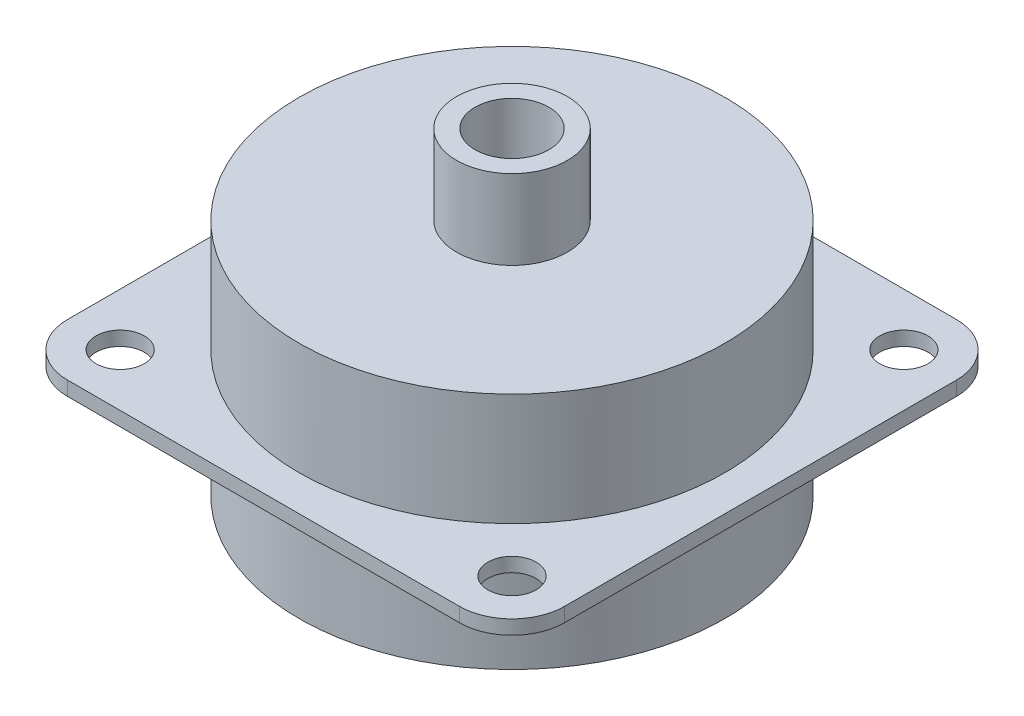
ISO-10303-21;
HEADER;
FILE_DESCRIPTION(('STEP AP214'),'2;1');
FILE_NAME('part.step','',(''),(''),'','','');
FILE_SCHEMA(('AUTOMOTIVE_DESIGN { 1 0 10303 214 1 1 1 1 }'));
ENDSEC;
DATA;
#1=APPLICATION_CONTEXT('core data for automotive mechanical design processes');
#2=APPLICATION_PROTOCOL_DEFINITION('international standard','automotive_design',2000,#1);
#3=PRODUCT_CONTEXT('',#1,'mechanical');
#4=PRODUCT('Part','Part','',(#3));
#5=PRODUCT_RELATED_PRODUCT_CATEGORY('part','',(#4));
#6=PRODUCT_DEFINITION_FORMATION('','',#4);
#7=PRODUCT_DEFINITION_CONTEXT('part definition',#1,'design');
#8=PRODUCT_DEFINITION('design','',#6,#7);
#9=PRODUCT_DEFINITION_SHAPE('','',#8);
#10=(LENGTH_UNIT() NAMED_UNIT(*) SI_UNIT(.MILLI.,.METRE.));
#11=(NAMED_UNIT(*) PLANE_ANGLE_UNIT() SI_UNIT($,.RADIAN.));
#12=(NAMED_UNIT(*) SI_UNIT($,.STERADIAN.) SOLID_ANGLE_UNIT());
#13=UNCERTAINTY_MEASURE_WITH_UNIT(LENGTH_MEASURE(1.E-05),#10,'distance_accuracy_value','');
#14=(GEOMETRIC_REPRESENTATION_CONTEXT(3) GLOBAL_UNCERTAINTY_ASSIGNED_CONTEXT((#13)) GLOBAL_UNIT_ASSIGNED_CONTEXT((#10,
#11,#12)) REPRESENTATION_CONTEXT('',''));
#15=CARTESIAN_POINT('',(0.,0.,0.));
#16=DIRECTION('',(0.,0.,1.));
#17=DIRECTION('',(1.,0.,0.));
#18=AXIS2_PLACEMENT_3D('',#15,#16,#17);
#19=CARTESIAN_POINT('',(0.,35.814,0.));
#20=DIRECTION('',(0.,1.,0.));
#21=DIRECTION('',(-1.,0.,0.));
#22=AXIS2_PLACEMENT_3D('',#19,#20,#21);
#23=CYLINDRICAL_SURFACE('',#22,19.05);
#24=CARTESIAN_POINT('',(0.,7.366,0.));
#25=DIRECTION('',(0.,1.,0.));
#26=DIRECTION('',(-1.,0.,0.));
#27=AXIS2_PLACEMENT_3D('',#24,#25,#26);
#28=CIRCLE('',#27,19.05);
#29=CARTESIAN_POINT('',(-19.05,7.366,0.));
#30=VERTEX_POINT('',#29);
#31=EDGE_CURVE('E166',#30,#30,#28,.T.);
#32=ORIENTED_EDGE('',*,*,#31,.T.);
#33=EDGE_LOOP('',(#32));
#34=FACE_BOUND('',#33,.T.);
#35=CARTESIAN_POINT('',(0.,17.399,0.));
#36=DIRECTION('',(0.,1.,0.));
#37=DIRECTION('',(0.,0.,1.));
#38=AXIS2_PLACEMENT_3D('',#35,#36,#37);
#39=CIRCLE('',#38,19.05);
#40=CARTESIAN_POINT('',(0.,17.399,19.05));
#41=VERTEX_POINT('',#40);
#42=EDGE_CURVE('E11',#41,#41,#39,.T.);
#43=ORIENTED_EDGE('',*,*,#42,.F.);
#44=EDGE_LOOP('',(#43));
#45=FACE_BOUND('',#44,.T.);
#46=ADVANCED_FACE('F34',(#34,#45),#23,.T.);
#47=CARTESIAN_POINT('',(0.,35.814,0.));
#48=DIRECTION('',(0.,1.,0.));
#49=DIRECTION('',(-1.,0.,0.));
#50=AXIS2_PLACEMENT_3D('',#47,#48,#49);
#51=CYLINDRICAL_SURFACE('',#50,3.302);
#52=CARTESIAN_POINT('',(0.,7.366,0.));
#53=DIRECTION('',(0.,1.,0.));
#54=DIRECTION('',(-1.,0.,0.));
#55=AXIS2_PLACEMENT_3D('',#52,#53,#54);
#56=CIRCLE('',#55,3.302);
#57=CARTESIAN_POINT('',(-3.302,7.366,0.));
#58=VERTEX_POINT('',#57);
#59=EDGE_CURVE('E163',#58,#58,#56,.T.);
#60=ORIENTED_EDGE('',*,*,#59,.F.);
#61=EDGE_LOOP('',(#60));
#62=FACE_BOUND('',#61,.T.);
#63=CARTESIAN_POINT('',(0.,35.814,0.));
#64=DIRECTION('',(0.,1.,0.));
#65=DIRECTION('',(-1.,0.,0.));
#66=AXIS2_PLACEMENT_3D('',#63,#64,#65);
#67=CIRCLE('',#66,3.302);
#68=CARTESIAN_POINT('',(-3.302,35.814,0.));
#69=VERTEX_POINT('',#68);
#70=EDGE_CURVE('E43',#69,#69,#67,.T.);
#71=ORIENTED_EDGE('',*,*,#70,.T.);
#72=EDGE_LOOP('',(#71));
#73=FACE_BOUND('',#72,.T.);
#74=ADVANCED_FACE('F36',(#62,#73),#51,.F.);
#75=CARTESIAN_POINT('',(-3.302,35.814,0.));
#76=DIRECTION('',(0.,-1.,0.));
#77=DIRECTION('',(1.,0.,0.));
#78=AXIS2_PLACEMENT_3D('',#75,#76,#77);
#79=PLANE('',#78);
#80=ORIENTED_EDGE('',*,*,#70,.F.);
#81=EDGE_LOOP('',(#80));
#82=FACE_BOUND('',#81,.T.);
#83=CARTESIAN_POINT('',(0.,35.814,0.));
#84=DIRECTION('',(0.,1.,0.));
#85=DIRECTION('',(-1.,0.,0.));
#86=AXIS2_PLACEMENT_3D('',#83,#84,#85);
#87=CIRCLE('',#86,4.953);
#88=CARTESIAN_POINT('',(-4.95300000000001,35.814,0.));
#89=VERTEX_POINT('',#88);
#90=EDGE_CURVE('E175',#89,#89,#87,.T.);
#91=ORIENTED_EDGE('',*,*,#90,.T.);
#92=EDGE_LOOP('',(#91));
#93=FACE_BOUND('',#92,.T.);
#94=ADVANCED_FACE('F181',(#82,#93),#79,.F.);
#95=CARTESIAN_POINT('',(0.,35.814,0.));
#96=DIRECTION('',(0.,1.,0.));
#97=DIRECTION('',(-1.,0.,0.));
#98=AXIS2_PLACEMENT_3D('',#95,#96,#97);
#99=CYLINDRICAL_SURFACE('',#98,4.953);
#100=ORIENTED_EDGE('',*,*,#90,.F.);
#101=EDGE_LOOP('',(#100));
#102=FACE_BOUND('',#101,.T.);
#103=CARTESIAN_POINT('',(0.,28.702,0.));
#104=DIRECTION('',(0.,1.,0.));
#105=DIRECTION('',(-1.,0.,0.));
#106=AXIS2_PLACEMENT_3D('',#103,#104,#105);
#107=CIRCLE('',#106,4.953);
#108=CARTESIAN_POINT('',(-4.953,28.702,0.));
#109=VERTEX_POINT('',#108);
#110=EDGE_CURVE('E172',#109,#109,#107,.T.);
#111=ORIENTED_EDGE('',*,*,#110,.T.);
#112=EDGE_LOOP('',(#111));
#113=FACE_BOUND('',#112,.T.);
#114=ADVANCED_FACE('F184',(#102,#113),#99,.T.);
#115=CARTESIAN_POINT('',(-4.953,28.702,0.));
#116=DIRECTION('',(0.,-1.,0.));
#117=DIRECTION('',(1.,0.,0.));
#118=AXIS2_PLACEMENT_3D('',#115,#116,#117);
#119=PLANE('',#118);
#120=ORIENTED_EDGE('',*,*,#110,.F.);
#121=EDGE_LOOP('',(#120));
#122=FACE_BOUND('',#121,.T.);
#123=CARTESIAN_POINT('',(0.,28.702,0.));
#124=DIRECTION('',(0.,1.,0.));
#125=DIRECTION('',(-1.,0.,0.));
#126=AXIS2_PLACEMENT_3D('',#123,#124,#125);
#127=CIRCLE('',#126,19.05);
#128=CARTESIAN_POINT('',(-19.05,28.702,0.));
#129=VERTEX_POINT('',#128);
#130=EDGE_CURVE('E169',#129,#129,#127,.T.);
#131=ORIENTED_EDGE('',*,*,#130,.T.);
#132=EDGE_LOOP('',(#131));
#133=FACE_BOUND('',#132,.T.);
#134=ADVANCED_FACE('F189',(#122,#133),#119,.F.);
#135=CARTESIAN_POINT('',(0.,18.669,0.));
#136=DIRECTION('',(0.,1.,0.));
#137=DIRECTION('',(0.,0.,1.));
#138=AXIS2_PLACEMENT_3D('',#135,#136,#137);
#139=CIRCLE('',#138,19.05);
#140=CARTESIAN_POINT('',(0.,18.669,19.05));
#141=VERTEX_POINT('',#140);
#142=EDGE_CURVE('E137',#141,#141,#139,.T.);
#143=ORIENTED_EDGE('',*,*,#142,.T.);
#144=EDGE_LOOP('',(#143));
#145=FACE_BOUND('',#144,.T.);
#146=ORIENTED_EDGE('',*,*,#130,.F.);
#147=EDGE_LOOP('',(#146));
#148=FACE_BOUND('',#147,.T.);
#149=ADVANCED_FACE('F195',(#145,#148),#23,.T.);
#150=CARTESIAN_POINT('',(-19.05,7.366,1.33025439009923E-13));
#151=DIRECTION('',(0.,1.,0.));
#152=DIRECTION('',(-1.,0.,0.));
#153=AXIS2_PLACEMENT_3D('',#150,#151,#152);
#154=PLANE('',#153);
#155=ORIENTED_EDGE('',*,*,#31,.F.);
#156=EDGE_LOOP('',(#155));
#157=FACE_BOUND('',#156,.T.);
#158=ORIENTED_EDGE('',*,*,#59,.T.);
#159=EDGE_LOOP('',(#158));
#160=FACE_BOUND('',#159,.T.);
#161=ADVANCED_FACE('F200',(#157,#160),#154,.F.);
#162=CARTESIAN_POINT('',(17.526,18.669,17.526));
#163=DIRECTION('',(0.,1.,0.));
#164=DIRECTION('',(0.,0.,1.));
#165=AXIS2_PLACEMENT_3D('',#162,#163,#164);
#166=PLANE('',#165);
#167=CARTESIAN_POINT('',(-17.526,18.669,-17.526));
#168=DIRECTION('',(0.,1.,0.));
#169=DIRECTION('',(0.,0.,1.));
#170=AXIS2_PLACEMENT_3D('',#167,#168,#169);
#171=CIRCLE('',#170,2.159);
#172=CARTESIAN_POINT('',(-17.526,18.669,-15.367));
#173=VERTEX_POINT('',#172);
#174=EDGE_CURVE('E239',#173,#173,#171,.T.);
#175=ORIENTED_EDGE('',*,*,#174,.F.);
#176=EDGE_LOOP('',(#175));
#177=FACE_BOUND('',#176,.T.);
#178=CARTESIAN_POINT('',(-17.526,18.669,17.526));
#179=DIRECTION('',(0.,1.,0.));
#180=DIRECTION('',(0.,0.,1.));
#181=AXIS2_PLACEMENT_3D('',#178,#179,#180);
#182=CIRCLE('',#181,2.159);
#183=CARTESIAN_POINT('',(-17.526,18.669,19.685));
#184=VERTEX_POINT('',#183);
#185=EDGE_CURVE('E249',#184,#184,#182,.T.);
#186=ORIENTED_EDGE('',*,*,#185,.F.);
#187=EDGE_LOOP('',(#186));
#188=FACE_BOUND('',#187,.T.);
#189=CARTESIAN_POINT('',(17.526,18.669,17.526));
#190=DIRECTION('',(0.,1.,0.));
#191=DIRECTION('',(0.,0.,1.));
#192=AXIS2_PLACEMENT_3D('',#189,#190,#191);
#193=CIRCLE('',#192,4.699);
#194=CARTESIAN_POINT('',(17.526,18.669,22.225));
#195=VERTEX_POINT('',#194);
#196=CARTESIAN_POINT('',(22.225,18.669,17.526));
#197=VERTEX_POINT('',#196);
#198=EDGE_CURVE('E148',#195,#197,#193,.T.);
#199=ORIENTED_EDGE('',*,*,#198,.T.);
#200=DIRECTION('',(0.,0.,-1.));
#201=VECTOR('',#200,1.);
#202=CARTESIAN_POINT('',(22.225,18.669,-17.526));
#203=LINE('',#202,#201);
#204=CARTESIAN_POINT('',(22.225,18.669,-17.526));
#205=VERTEX_POINT('',#204);
#206=EDGE_CURVE('E95',#197,#205,#203,.T.);
#207=ORIENTED_EDGE('',*,*,#206,.T.);
#208=CARTESIAN_POINT('',(17.526,18.669,-17.526));
#209=DIRECTION('',(0.,1.,0.));
#210=DIRECTION('',(0.,0.,-1.));
#211=AXIS2_PLACEMENT_3D('',#208,#209,#210);
#212=CIRCLE('',#211,4.699);
#213=CARTESIAN_POINT('',(17.526,18.669,-22.225));
#214=VERTEX_POINT('',#213);
#215=EDGE_CURVE('E257',#205,#214,#212,.T.);
#216=ORIENTED_EDGE('',*,*,#215,.T.);
#217=DIRECTION('',(-1.,0.,0.));
#218=VECTOR('',#217,1.);
#219=CARTESIAN_POINT('',(-17.526,18.669,-22.225));
#220=LINE('',#219,#218);
#221=CARTESIAN_POINT('',(-17.526,18.669,-22.225));
#222=VERTEX_POINT('',#221);
#223=EDGE_CURVE('E259',#214,#222,#220,.T.);
#224=ORIENTED_EDGE('',*,*,#223,.T.);
#225=CARTESIAN_POINT('',(-17.526,18.669,-17.526));
#226=DIRECTION('',(0.,1.,0.));
#227=DIRECTION('',(0.,0.,1.));
#228=AXIS2_PLACEMENT_3D('',#225,#226,#227);
#229=CIRCLE('',#228,4.699);
#230=CARTESIAN_POINT('',(-22.225,18.669,-17.526));
#231=VERTEX_POINT('',#230);
#232=EDGE_CURVE('E115',#222,#231,#229,.T.);
#233=ORIENTED_EDGE('',*,*,#232,.T.);
#234=DIRECTION('',(0.,0.,1.));
#235=VECTOR('',#234,1.);
#236=CARTESIAN_POINT('',(-22.225,18.669,-17.526));
#237=LINE('',#236,#235);
#238=CARTESIAN_POINT('',(-22.225,18.669,17.526));
#239=VERTEX_POINT('',#238);
#240=EDGE_CURVE('E108',#231,#239,#237,.T.);
#241=ORIENTED_EDGE('',*,*,#240,.T.);
#242=CARTESIAN_POINT('',(-17.526,18.669,17.526));
#243=DIRECTION('',(0.,1.,0.));
#244=DIRECTION('',(0.,0.,1.));
#245=AXIS2_PLACEMENT_3D('',#242,#243,#244);
#246=CIRCLE('',#245,4.699);
#247=CARTESIAN_POINT('',(-17.526,18.669,22.225));
#248=VERTEX_POINT('',#247);
#249=EDGE_CURVE('E113',#239,#248,#246,.T.);
#250=ORIENTED_EDGE('',*,*,#249,.T.);
#251=DIRECTION('',(1.,0.,0.));
#252=VECTOR('',#251,1.);
#253=CARTESIAN_POINT('',(-17.526,18.669,22.225));
#254=LINE('',#253,#252);
#255=EDGE_CURVE('E51',#248,#195,#254,.T.);
#256=ORIENTED_EDGE('',*,*,#255,.T.);
#257=EDGE_LOOP('',(#199,#207,#216,#224,#233,#241,#250,#256));
#258=FACE_BOUND('',#257,.T.);
#259=ORIENTED_EDGE('',*,*,#142,.F.);
#260=EDGE_LOOP('',(#259));
#261=FACE_BOUND('',#260,.T.);
#262=CARTESIAN_POINT('',(17.526,18.669,17.526));
#263=DIRECTION('',(0.,1.,0.));
#264=DIRECTION('',(0.,0.,1.));
#265=AXIS2_PLACEMENT_3D('',#262,#263,#264);
#266=CIRCLE('',#265,2.159);
#267=CARTESIAN_POINT('',(17.526,18.669,19.685));
#268=VERTEX_POINT('',#267);
#269=EDGE_CURVE('E244',#268,#268,#266,.T.);
#270=ORIENTED_EDGE('',*,*,#269,.F.);
#271=EDGE_LOOP('',(#270));
#272=FACE_BOUND('',#271,.T.);
#273=CARTESIAN_POINT('',(17.526,18.669,-17.526));
#274=DIRECTION('',(0.,1.,0.));
#275=DIRECTION('',(0.,0.,1.));
#276=AXIS2_PLACEMENT_3D('',#273,#274,#275);
#277=CIRCLE('',#276,2.159);
#278=CARTESIAN_POINT('',(17.526,18.669,-15.367));
#279=VERTEX_POINT('',#278);
#280=EDGE_CURVE('E233',#279,#279,#277,.T.);
#281=ORIENTED_EDGE('',*,*,#280,.F.);
#282=EDGE_LOOP('',(#281));
#283=FACE_BOUND('',#282,.T.);
#284=ADVANCED_FACE('F110',(#177,#188,#258,#261,#272,#283),#166,.T.);
#285=CARTESIAN_POINT('',(17.526,17.399,17.526));
#286=DIRECTION('',(0.,1.,0.));
#287=DIRECTION('',(0.,0.,1.));
#288=AXIS2_PLACEMENT_3D('',#285,#286,#287);
#289=PLANE('',#288);
#290=CARTESIAN_POINT('',(-17.526,17.399,-17.526));
#291=DIRECTION('',(0.,1.,0.));
#292=DIRECTION('',(0.,0.,1.));
#293=AXIS2_PLACEMENT_3D('',#290,#291,#292);
#294=CIRCLE('',#293,2.159);
#295=CARTESIAN_POINT('',(-17.526,17.399,-15.367));
#296=VERTEX_POINT('',#295);
#297=EDGE_CURVE('E236',#296,#296,#294,.T.);
#298=ORIENTED_EDGE('',*,*,#297,.T.);
#299=EDGE_LOOP('',(#298));
#300=FACE_BOUND('',#299,.T.);
#301=CARTESIAN_POINT('',(-17.526,17.399,17.526));
#302=DIRECTION('',(0.,1.,0.));
#303=DIRECTION('',(0.,0.,1.));
#304=AXIS2_PLACEMENT_3D('',#301,#302,#303);
#305=CIRCLE('',#304,2.159);
#306=CARTESIAN_POINT('',(-17.526,17.399,19.685));
#307=VERTEX_POINT('',#306);
#308=EDGE_CURVE('E247',#307,#307,#305,.T.);
#309=ORIENTED_EDGE('',*,*,#308,.T.);
#310=EDGE_LOOP('',(#309));
#311=FACE_BOUND('',#310,.T.);
#312=CARTESIAN_POINT('',(17.526,17.399,17.526));
#313=DIRECTION('',(0.,1.,0.));
#314=DIRECTION('',(0.,0.,1.));
#315=AXIS2_PLACEMENT_3D('',#312,#313,#314);
#316=CIRCLE('',#315,4.699);
#317=CARTESIAN_POINT('',(17.526,17.399,22.225));
#318=VERTEX_POINT('',#317);
#319=CARTESIAN_POINT('',(22.225,17.399,17.526));
#320=VERTEX_POINT('',#319);
#321=EDGE_CURVE('E133',#318,#320,#316,.T.);
#322=ORIENTED_EDGE('',*,*,#321,.F.);
#323=DIRECTION('',(1.,0.,0.));
#324=VECTOR('',#323,1.);
#325=CARTESIAN_POINT('',(-17.526,17.399,22.225));
#326=LINE('',#325,#324);
#327=CARTESIAN_POINT('',(-17.526,17.399,22.225));
#328=VERTEX_POINT('',#327);
#329=EDGE_CURVE('E86',#328,#318,#326,.T.);
#330=ORIENTED_EDGE('',*,*,#329,.F.);
#331=CARTESIAN_POINT('',(-17.526,17.399,17.526));
#332=DIRECTION('',(0.,1.,0.));
#333=DIRECTION('',(0.,0.,1.));
#334=AXIS2_PLACEMENT_3D('',#331,#332,#333);
#335=CIRCLE('',#334,4.699);
#336=CARTESIAN_POINT('',(-22.225,17.399,17.526));
#337=VERTEX_POINT('',#336);
#338=EDGE_CURVE('E80',#337,#328,#335,.T.);
#339=ORIENTED_EDGE('',*,*,#338,.F.);
#340=DIRECTION('',(0.,0.,1.));
#341=VECTOR('',#340,1.);
#342=CARTESIAN_POINT('',(-22.225,17.399,-17.526));
#343=LINE('',#342,#341);
#344=CARTESIAN_POINT('',(-22.225,17.399,-17.526));
#345=VERTEX_POINT('',#344);
#346=EDGE_CURVE('E123',#345,#337,#343,.T.);
#347=ORIENTED_EDGE('',*,*,#346,.F.);
#348=CARTESIAN_POINT('',(-17.526,17.399,-17.526));
#349=DIRECTION('',(0.,1.,0.));
#350=DIRECTION('',(0.,0.,1.));
#351=AXIS2_PLACEMENT_3D('',#348,#349,#350);
#352=CIRCLE('',#351,4.699);
#353=CARTESIAN_POINT('',(-17.526,17.399,-22.225));
#354=VERTEX_POINT('',#353);
#355=EDGE_CURVE('E143',#354,#345,#352,.T.);
#356=ORIENTED_EDGE('',*,*,#355,.F.);
#357=DIRECTION('',(-1.,0.,0.));
#358=VECTOR('',#357,1.);
#359=CARTESIAN_POINT('',(-17.526,17.399,-22.225));
#360=LINE('',#359,#358);
#361=CARTESIAN_POINT('',(17.526,17.399,-22.225));
#362=VERTEX_POINT('',#361);
#363=EDGE_CURVE('E141',#362,#354,#360,.T.);
#364=ORIENTED_EDGE('',*,*,#363,.F.);
#365=CARTESIAN_POINT('',(17.526,17.399,-17.526));
#366=DIRECTION('',(0.,1.,0.));
#367=DIRECTION('',(0.,0.,-1.));
#368=AXIS2_PLACEMENT_3D('',#365,#366,#367);
#369=CIRCLE('',#368,4.699);
#370=CARTESIAN_POINT('',(22.225,17.399,-17.526));
#371=VERTEX_POINT('',#370);
#372=EDGE_CURVE('E139',#371,#362,#369,.T.);
#373=ORIENTED_EDGE('',*,*,#372,.F.);
#374=DIRECTION('',(0.,0.,-1.));
#375=VECTOR('',#374,1.);
#376=CARTESIAN_POINT('',(22.225,17.399,-17.526));
#377=LINE('',#376,#375);
#378=EDGE_CURVE('E136',#320,#371,#377,.T.);
#379=ORIENTED_EDGE('',*,*,#378,.F.);
#380=EDGE_LOOP('',(#322,#330,#339,#347,#356,#364,#373,#379));
#381=FACE_BOUND('',#380,.T.);
#382=ORIENTED_EDGE('',*,*,#42,.T.);
#383=EDGE_LOOP('',(#382));
#384=FACE_BOUND('',#383,.T.);
#385=CARTESIAN_POINT('',(17.526,17.399,17.526));
#386=DIRECTION('',(0.,1.,0.));
#387=DIRECTION('',(0.,0.,1.));
#388=AXIS2_PLACEMENT_3D('',#385,#386,#387);
#389=CIRCLE('',#388,2.159);
#390=CARTESIAN_POINT('',(17.526,17.399,19.685));
#391=VERTEX_POINT('',#390);
#392=EDGE_CURVE('E228',#391,#391,#389,.T.);
#393=ORIENTED_EDGE('',*,*,#392,.T.);
#394=EDGE_LOOP('',(#393));
#395=FACE_BOUND('',#394,.T.);
#396=CARTESIAN_POINT('',(17.526,17.399,-17.526));
#397=DIRECTION('',(0.,1.,0.));
#398=DIRECTION('',(0.,0.,1.));
#399=AXIS2_PLACEMENT_3D('',#396,#397,#398);
#400=CIRCLE('',#399,2.159);
#401=CARTESIAN_POINT('',(17.526,17.399,-15.367));
#402=VERTEX_POINT('',#401);
#403=EDGE_CURVE('E231',#402,#402,#400,.T.);
#404=ORIENTED_EDGE('',*,*,#403,.T.);
#405=EDGE_LOOP('',(#404));
#406=FACE_BOUND('',#405,.T.);
#407=ADVANCED_FACE('F219',(#300,#311,#381,#384,#395,#406),#289,.F.);
#408=CARTESIAN_POINT('',(17.526,18.669,17.526));
#409=DIRECTION('',(0.,-1.,0.));
#410=DIRECTION('',(0.,0.,-1.));
#411=AXIS2_PLACEMENT_3D('',#408,#409,#410);
#412=CYLINDRICAL_SURFACE('',#411,4.699);
#413=ORIENTED_EDGE('',*,*,#321,.T.);
#414=DIRECTION('',(0.,-1.,0.));
#415=VECTOR('',#414,1.);
#416=CARTESIAN_POINT('',(22.225,18.669,17.526));
#417=LINE('',#416,#415);
#418=EDGE_CURVE('E161',#197,#320,#417,.T.);
#419=ORIENTED_EDGE('',*,*,#418,.F.);
#420=ORIENTED_EDGE('',*,*,#198,.F.);
#421=DIRECTION('',(0.,-1.,0.));
#422=VECTOR('',#421,1.);
#423=CARTESIAN_POINT('',(17.526,18.669,22.225));
#424=LINE('',#423,#422);
#425=EDGE_CURVE('E129',#195,#318,#424,.T.);
#426=ORIENTED_EDGE('',*,*,#425,.T.);
#427=EDGE_LOOP('',(#413,#419,#420,#426));
#428=FACE_BOUND('',#427,.T.);
#429=ADVANCED_FACE('F222',(#428),#412,.T.);
#430=CARTESIAN_POINT('',(22.225,18.669,-17.526));
#431=DIRECTION('',(-1.,0.,0.));
#432=DIRECTION('',(0.,0.,1.));
#433=AXIS2_PLACEMENT_3D('',#430,#431,#432);
#434=PLANE('',#433);
#435=ORIENTED_EDGE('',*,*,#378,.T.);
#436=DIRECTION('',(0.,-1.,0.));
#437=VECTOR('',#436,1.);
#438=CARTESIAN_POINT('',(22.225,18.669,-17.526));
#439=LINE('',#438,#437);
#440=EDGE_CURVE('E158',#205,#371,#439,.T.);
#441=ORIENTED_EDGE('',*,*,#440,.F.);
#442=ORIENTED_EDGE('',*,*,#206,.F.);
#443=ORIENTED_EDGE('',*,*,#418,.T.);
#444=EDGE_LOOP('',(#435,#441,#442,#443));
#445=FACE_BOUND('',#444,.T.);
#446=ADVANCED_FACE('F299',(#445),#434,.F.);
#447=CARTESIAN_POINT('',(17.526,18.669,-17.526));
#448=DIRECTION('',(0.,-1.,0.));
#449=DIRECTION('',(0.,0.,-1.));
#450=AXIS2_PLACEMENT_3D('',#447,#448,#449);
#451=CYLINDRICAL_SURFACE('',#450,4.699);
#452=ORIENTED_EDGE('',*,*,#372,.T.);
#453=DIRECTION('',(0.,-1.,0.));
#454=VECTOR('',#453,1.);
#455=CARTESIAN_POINT('',(17.526,18.669,-22.225));
#456=LINE('',#455,#454);
#457=EDGE_CURVE('E155',#214,#362,#456,.T.);
#458=ORIENTED_EDGE('',*,*,#457,.F.);
#459=ORIENTED_EDGE('',*,*,#215,.F.);
#460=ORIENTED_EDGE('',*,*,#440,.T.);
#461=EDGE_LOOP('',(#452,#458,#459,#460));
#462=FACE_BOUND('',#461,.T.);
#463=ADVANCED_FACE('F296',(#462),#451,.T.);
#464=CARTESIAN_POINT('',(-17.526,18.669,-22.225));
#465=DIRECTION('',(0.,0.,1.));
#466=DIRECTION('',(1.,0.,0.));
#467=AXIS2_PLACEMENT_3D('',#464,#465,#466);
#468=PLANE('',#467);
#469=ORIENTED_EDGE('',*,*,#363,.T.);
#470=DIRECTION('',(0.,-1.,0.));
#471=VECTOR('',#470,1.);
#472=CARTESIAN_POINT('',(-17.526,18.669,-22.225));
#473=LINE('',#472,#471);
#474=EDGE_CURVE('E152',#222,#354,#473,.T.);
#475=ORIENTED_EDGE('',*,*,#474,.F.);
#476=ORIENTED_EDGE('',*,*,#223,.F.);
#477=ORIENTED_EDGE('',*,*,#457,.T.);
#478=EDGE_LOOP('',(#469,#475,#476,#477));
#479=FACE_BOUND('',#478,.T.);
#480=ADVANCED_FACE('F265',(#479),#468,.F.);
#481=CARTESIAN_POINT('',(-17.526,18.669,-17.526));
#482=DIRECTION('',(0.,-1.,0.));
#483=DIRECTION('',(0.,0.,-1.));
#484=AXIS2_PLACEMENT_3D('',#481,#482,#483);
#485=CYLINDRICAL_SURFACE('',#484,4.699);
#486=ORIENTED_EDGE('',*,*,#355,.T.);
#487=DIRECTION('',(0.,-1.,0.));
#488=VECTOR('',#487,1.);
#489=CARTESIAN_POINT('',(-22.225,18.669,-17.526));
#490=LINE('',#489,#488);
#491=EDGE_CURVE('E124',#231,#345,#490,.T.);
#492=ORIENTED_EDGE('',*,*,#491,.F.);
#493=ORIENTED_EDGE('',*,*,#232,.F.);
#494=ORIENTED_EDGE('',*,*,#474,.T.);
#495=EDGE_LOOP('',(#486,#492,#493,#494));
#496=FACE_BOUND('',#495,.T.);
#497=ADVANCED_FACE('F269',(#496),#485,.T.);
#498=CARTESIAN_POINT('',(-22.225,18.669,-17.526));
#499=DIRECTION('',(1.,0.,0.));
#500=DIRECTION('',(0.,0.,-1.));
#501=AXIS2_PLACEMENT_3D('',#498,#499,#500);
#502=PLANE('',#501);
#503=ORIENTED_EDGE('',*,*,#346,.T.);
#504=DIRECTION('',(0.,-1.,0.));
#505=VECTOR('',#504,1.);
#506=CARTESIAN_POINT('',(-22.225,18.669,17.526));
#507=LINE('',#506,#505);
#508=EDGE_CURVE('E120',#239,#337,#507,.T.);
#509=ORIENTED_EDGE('',*,*,#508,.F.);
#510=ORIENTED_EDGE('',*,*,#240,.F.);
#511=ORIENTED_EDGE('',*,*,#491,.T.);
#512=EDGE_LOOP('',(#503,#509,#510,#511));
#513=FACE_BOUND('',#512,.T.);
#514=ADVANCED_FACE('F121',(#513),#502,.F.);
#515=CARTESIAN_POINT('',(-17.526,18.669,17.526));
#516=DIRECTION('',(0.,-1.,0.));
#517=DIRECTION('',(0.,0.,-1.));
#518=AXIS2_PLACEMENT_3D('',#515,#516,#517);
#519=CYLINDRICAL_SURFACE('',#518,4.699);
#520=ORIENTED_EDGE('',*,*,#338,.T.);
#521=DIRECTION('',(0.,-1.,0.));
#522=VECTOR('',#521,1.);
#523=CARTESIAN_POINT('',(-17.526,18.669,22.225));
#524=LINE('',#523,#522);
#525=EDGE_CURVE('E125',#248,#328,#524,.T.);
#526=ORIENTED_EDGE('',*,*,#525,.F.);
#527=ORIENTED_EDGE('',*,*,#249,.F.);
#528=ORIENTED_EDGE('',*,*,#508,.T.);
#529=EDGE_LOOP('',(#520,#526,#527,#528));
#530=FACE_BOUND('',#529,.T.);
#531=ADVANCED_FACE('F127',(#530),#519,.T.);
#532=CARTESIAN_POINT('',(-17.526,18.669,22.225));
#533=DIRECTION('',(0.,0.,-1.));
#534=DIRECTION('',(-1.,0.,0.));
#535=AXIS2_PLACEMENT_3D('',#532,#533,#534);
#536=PLANE('',#535);
#537=ORIENTED_EDGE('',*,*,#329,.T.);
#538=ORIENTED_EDGE('',*,*,#425,.F.);
#539=ORIENTED_EDGE('',*,*,#255,.F.);
#540=ORIENTED_EDGE('',*,*,#525,.T.);
#541=EDGE_LOOP('',(#537,#538,#539,#540));
#542=FACE_BOUND('',#541,.T.);
#543=ADVANCED_FACE('F276',(#542),#536,.F.);
#544=CARTESIAN_POINT('',(-17.526,18.669,17.526));
#545=DIRECTION('',(0.,-1.,0.));
#546=DIRECTION('',(0.,0.,-1.));
#547=AXIS2_PLACEMENT_3D('',#544,#545,#546);
#548=CYLINDRICAL_SURFACE('',#547,2.159);
#549=ORIENTED_EDGE('',*,*,#185,.T.);
#550=EDGE_LOOP('',(#549));
#551=FACE_BOUND('',#550,.T.);
#552=ORIENTED_EDGE('',*,*,#308,.F.);
#553=EDGE_LOOP('',(#552));
#554=FACE_BOUND('',#553,.T.);
#555=ADVANCED_FACE('F278',(#551,#554),#548,.F.);
#556=CARTESIAN_POINT('',(17.526,18.669,17.526));
#557=DIRECTION('',(0.,-1.,0.));
#558=DIRECTION('',(0.,0.,-1.));
#559=AXIS2_PLACEMENT_3D('',#556,#557,#558);
#560=CYLINDRICAL_SURFACE('',#559,2.159);
#561=ORIENTED_EDGE('',*,*,#269,.T.);
#562=EDGE_LOOP('',(#561));
#563=FACE_BOUND('',#562,.T.);
#564=ORIENTED_EDGE('',*,*,#392,.F.);
#565=EDGE_LOOP('',(#564));
#566=FACE_BOUND('',#565,.T.);
#567=ADVANCED_FACE('F284',(#563,#566),#560,.F.);
#568=CARTESIAN_POINT('',(-17.526,18.669,-17.526));
#569=DIRECTION('',(0.,-1.,0.));
#570=DIRECTION('',(0.,0.,-1.));
#571=AXIS2_PLACEMENT_3D('',#568,#569,#570);
#572=CYLINDRICAL_SURFACE('',#571,2.159);
#573=ORIENTED_EDGE('',*,*,#174,.T.);
#574=EDGE_LOOP('',(#573));
#575=FACE_BOUND('',#574,.T.);
#576=ORIENTED_EDGE('',*,*,#297,.F.);
#577=EDGE_LOOP('',(#576));
#578=FACE_BOUND('',#577,.T.);
#579=ADVANCED_FACE('F352',(#575,#578),#572,.F.);
#580=CARTESIAN_POINT('',(17.526,18.669,-17.526));
#581=DIRECTION('',(0.,-1.,0.));
#582=DIRECTION('',(0.,0.,-1.));
#583=AXIS2_PLACEMENT_3D('',#580,#581,#582);
#584=CYLINDRICAL_SURFACE('',#583,2.159);
#585=ORIENTED_EDGE('',*,*,#280,.T.);
#586=EDGE_LOOP('',(#585));
#587=FACE_BOUND('',#586,.T.);
#588=ORIENTED_EDGE('',*,*,#403,.F.);
#589=EDGE_LOOP('',(#588));
#590=FACE_BOUND('',#589,.T.);
#591=ADVANCED_FACE('F362',(#587,#590),#584,.F.);
#592=CLOSED_SHELL('',(#46,#74,#94,#114,#134,#149,#161,#284,#407,#429,#446,#463,#480,#497,#514,
#531,#543,#555,#567,#579,#591));
#593=MANIFOLD_SOLID_BREP('B2',#592);
#594=ADVANCED_BREP_SHAPE_REPRESENTATION('',(#18,#593),#14);
#595=SHAPE_DEFINITION_REPRESENTATION(#9,#594);
ENDSEC;
END-ISO-10303-21;
